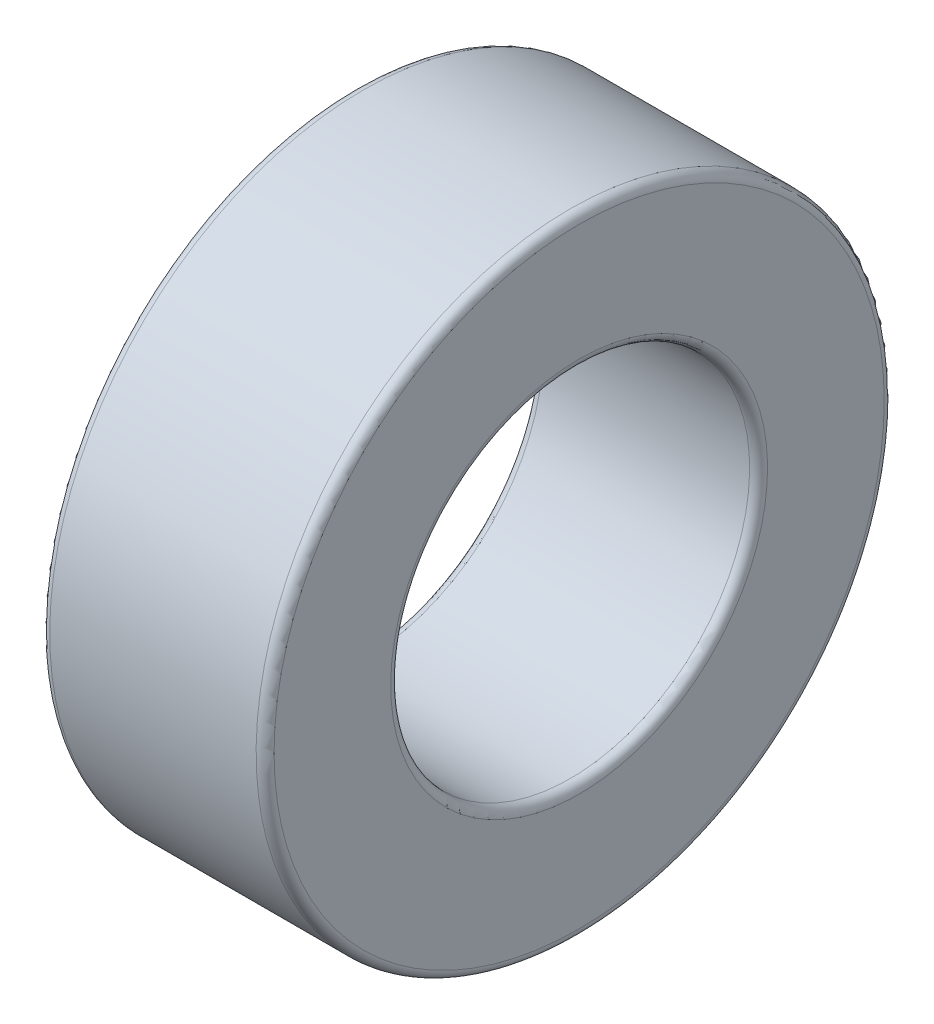
ISO-10303-21;
HEADER;
FILE_DESCRIPTION(('STEP AP214'),'2;1');
FILE_NAME('part.step','',(''),(''),'','','');
FILE_SCHEMA(('AUTOMOTIVE_DESIGN { 1 0 10303 214 1 1 1 1 }'));
ENDSEC;
DATA;
#1=APPLICATION_CONTEXT('core data for automotive mechanical design processes');
#2=APPLICATION_PROTOCOL_DEFINITION('international standard','automotive_design',2000,#1);
#3=PRODUCT_CONTEXT('',#1,'mechanical');
#4=PRODUCT('Part','Part','',(#3));
#5=PRODUCT_RELATED_PRODUCT_CATEGORY('part','',(#4));
#6=PRODUCT_DEFINITION_FORMATION('','',#4);
#7=PRODUCT_DEFINITION_CONTEXT('part definition',#1,'design');
#8=PRODUCT_DEFINITION('design','',#6,#7);
#9=PRODUCT_DEFINITION_SHAPE('','',#8);
#10=(LENGTH_UNIT() NAMED_UNIT(*) SI_UNIT(.MILLI.,.METRE.));
#11=(NAMED_UNIT(*) PLANE_ANGLE_UNIT() SI_UNIT($,.RADIAN.));
#12=(NAMED_UNIT(*) SI_UNIT($,.STERADIAN.) SOLID_ANGLE_UNIT());
#13=UNCERTAINTY_MEASURE_WITH_UNIT(LENGTH_MEASURE(1.E-05),#10,'distance_accuracy_value','');
#14=(GEOMETRIC_REPRESENTATION_CONTEXT(3) GLOBAL_UNCERTAINTY_ASSIGNED_CONTEXT((#13)) GLOBAL_UNIT_ASSIGNED_CONTEXT((#10,
#11,#12)) REPRESENTATION_CONTEXT('',''));
#15=CARTESIAN_POINT('',(0.,0.,0.));
#16=DIRECTION('',(0.,0.,1.));
#17=DIRECTION('',(1.,0.,0.));
#18=AXIS2_PLACEMENT_3D('',#15,#16,#17);
#19=CARTESIAN_POINT('',(0.,2.75,0.));
#20=DIRECTION('',(-1.,0.,0.));
#21=DIRECTION('',(0.,-1.,0.));
#22=AXIS2_PLACEMENT_3D('',#19,#20,#21);
#23=PLANE('',#22);
#24=CARTESIAN_POINT('',(0.,0.,0.));
#25=DIRECTION('',(1.,0.,0.));
#26=DIRECTION('',(0.,1.,0.));
#27=AXIS2_PLACEMENT_3D('',#24,#25,#26);
#28=CIRCLE('',#27,3.4);
#29=CARTESIAN_POINT('',(0.,3.4,0.));
#30=VERTEX_POINT('',#29);
#31=EDGE_CURVE('E28',#30,#30,#28,.T.);
#32=ORIENTED_EDGE('',*,*,#31,.F.);
#33=EDGE_LOOP('',(#32));
#34=FACE_BOUND('',#33,.T.);
#35=CARTESIAN_POINT('',(0.,0.,0.));
#36=DIRECTION('',(1.,0.,0.));
#37=DIRECTION('',(0.,1.,0.));
#38=AXIS2_PLACEMENT_3D('',#35,#36,#37);
#39=CIRCLE('',#38,2.1);
#40=CARTESIAN_POINT('',(0.,2.1,0.));
#41=VERTEX_POINT('',#40);
#42=EDGE_CURVE('E11',#41,#41,#39,.T.);
#43=ORIENTED_EDGE('',*,*,#42,.T.);
#44=EDGE_LOOP('',(#43));
#45=FACE_BOUND('',#44,.T.);
#46=ADVANCED_FACE('F18',(#34,#45),#23,.T.);
#47=CARTESIAN_POINT('',(0.1,0.,0.));
#48=DIRECTION('',(1.,0.,0.));
#49=DIRECTION('',(0.,0.,-1.));
#50=AXIS2_PLACEMENT_3D('',#47,#48,#49);
#51=TOROIDAL_SURFACE('',#50,3.4,0.1);
#52=CARTESIAN_POINT('',(0.1,0.,0.));
#53=DIRECTION('',(1.,0.,0.));
#54=DIRECTION('',(0.,1.,0.));
#55=AXIS2_PLACEMENT_3D('',#52,#53,#54);
#56=CIRCLE('',#55,3.5);
#57=CARTESIAN_POINT('',(0.1,3.5,0.));
#58=VERTEX_POINT('',#57);
#59=EDGE_CURVE('E127',#58,#58,#56,.T.);
#60=ORIENTED_EDGE('',*,*,#59,.F.);
#61=EDGE_LOOP('',(#60));
#62=FACE_BOUND('',#61,.T.);
#63=ORIENTED_EDGE('',*,*,#31,.T.);
#64=EDGE_LOOP('',(#63));
#65=FACE_BOUND('',#64,.T.);
#66=ADVANCED_FACE('F159',(#62,#65),#51,.T.);
#67=CARTESIAN_POINT('',(1.25,0.,0.));
#68=DIRECTION('',(-1.,0.,0.));
#69=DIRECTION('',(0.,1.,0.));
#70=AXIS2_PLACEMENT_3D('',#67,#68,#69);
#71=CYLINDRICAL_SURFACE('',#70,3.5);
#72=CARTESIAN_POINT('',(2.4,0.,0.));
#73=DIRECTION('',(1.,0.,0.));
#74=DIRECTION('',(0.,1.,0.));
#75=AXIS2_PLACEMENT_3D('',#72,#73,#74);
#76=CIRCLE('',#75,3.5);
#77=CARTESIAN_POINT('',(2.4,3.5,0.));
#78=VERTEX_POINT('',#77);
#79=EDGE_CURVE('E22',#78,#78,#76,.T.);
#80=ORIENTED_EDGE('',*,*,#79,.F.);
#81=EDGE_LOOP('',(#80));
#82=FACE_BOUND('',#81,.T.);
#83=ORIENTED_EDGE('',*,*,#59,.T.);
#84=EDGE_LOOP('',(#83));
#85=FACE_BOUND('',#84,.T.);
#86=ADVANCED_FACE('F164',(#82,#85),#71,.T.);
#87=CARTESIAN_POINT('',(2.4,0.,0.));
#88=DIRECTION('',(1.,0.,0.));
#89=DIRECTION('',(0.,0.,-1.));
#90=AXIS2_PLACEMENT_3D('',#87,#88,#89);
#91=TOROIDAL_SURFACE('',#90,3.4,0.1);
#92=CARTESIAN_POINT('',(2.5,0.,0.));
#93=DIRECTION('',(1.,0.,0.));
#94=DIRECTION('',(0.,1.,0.));
#95=AXIS2_PLACEMENT_3D('',#92,#93,#94);
#96=CIRCLE('',#95,3.4);
#97=CARTESIAN_POINT('',(2.5,3.4,0.));
#98=VERTEX_POINT('',#97);
#99=EDGE_CURVE('E110',#98,#98,#96,.T.);
#100=ORIENTED_EDGE('',*,*,#99,.F.);
#101=EDGE_LOOP('',(#100));
#102=FACE_BOUND('',#101,.T.);
#103=ORIENTED_EDGE('',*,*,#79,.T.);
#104=EDGE_LOOP('',(#103));
#105=FACE_BOUND('',#104,.T.);
#106=ADVANCED_FACE('F190',(#102,#105),#91,.T.);
#107=CARTESIAN_POINT('',(2.5,2.75,0.));
#108=DIRECTION('',(1.,0.,0.));
#109=DIRECTION('',(0.,1.,0.));
#110=AXIS2_PLACEMENT_3D('',#107,#108,#109);
#111=PLANE('',#110);
#112=CARTESIAN_POINT('',(2.5,0.,0.));
#113=DIRECTION('',(1.,0.,0.));
#114=DIRECTION('',(0.,1.,0.));
#115=AXIS2_PLACEMENT_3D('',#112,#113,#114);
#116=CIRCLE('',#115,2.1);
#117=CARTESIAN_POINT('',(2.5,2.1,0.));
#118=VERTEX_POINT('',#117);
#119=EDGE_CURVE('E76',#118,#118,#116,.T.);
#120=ORIENTED_EDGE('',*,*,#119,.F.);
#121=EDGE_LOOP('',(#120));
#122=FACE_BOUND('',#121,.T.);
#123=ORIENTED_EDGE('',*,*,#99,.T.);
#124=EDGE_LOOP('',(#123));
#125=FACE_BOUND('',#124,.T.);
#126=ADVANCED_FACE('F155',(#122,#125),#111,.T.);
#127=CARTESIAN_POINT('',(2.4,0.,0.));
#128=DIRECTION('',(1.,0.,0.));
#129=DIRECTION('',(0.,0.,-1.));
#130=AXIS2_PLACEMENT_3D('',#127,#128,#129);
#131=TOROIDAL_SURFACE('',#130,2.1,0.1);
#132=CARTESIAN_POINT('',(2.4,0.,0.));
#133=DIRECTION('',(1.,0.,0.));
#134=DIRECTION('',(0.,1.,0.));
#135=AXIS2_PLACEMENT_3D('',#132,#133,#134);
#136=CIRCLE('',#135,2.);
#137=CARTESIAN_POINT('',(2.4,2.,0.));
#138=VERTEX_POINT('',#137);
#139=EDGE_CURVE('E82',#138,#138,#136,.T.);
#140=ORIENTED_EDGE('',*,*,#139,.F.);
#141=EDGE_LOOP('',(#140));
#142=FACE_BOUND('',#141,.T.);
#143=ORIENTED_EDGE('',*,*,#119,.T.);
#144=EDGE_LOOP('',(#143));
#145=FACE_BOUND('',#144,.T.);
#146=ADVANCED_FACE('F145',(#142,#145),#131,.T.);
#147=CARTESIAN_POINT('',(1.25,0.,0.));
#148=DIRECTION('',(-1.,0.,0.));
#149=DIRECTION('',(0.,1.,0.));
#150=AXIS2_PLACEMENT_3D('',#147,#148,#149);
#151=CYLINDRICAL_SURFACE('',#150,2.);
#152=CARTESIAN_POINT('',(0.1,0.,0.));
#153=DIRECTION('',(1.,0.,0.));
#154=DIRECTION('',(0.,1.,0.));
#155=AXIS2_PLACEMENT_3D('',#152,#153,#154);
#156=CIRCLE('',#155,2.);
#157=CARTESIAN_POINT('',(0.1,2.,0.));
#158=VERTEX_POINT('',#157);
#159=EDGE_CURVE('E98',#158,#158,#156,.T.);
#160=ORIENTED_EDGE('',*,*,#159,.F.);
#161=EDGE_LOOP('',(#160));
#162=FACE_BOUND('',#161,.T.);
#163=ORIENTED_EDGE('',*,*,#139,.T.);
#164=EDGE_LOOP('',(#163));
#165=FACE_BOUND('',#164,.T.);
#166=ADVANCED_FACE('F142',(#162,#165),#151,.F.);
#167=CARTESIAN_POINT('',(0.1,0.,0.));
#168=DIRECTION('',(1.,0.,0.));
#169=DIRECTION('',(0.,0.,-1.));
#170=AXIS2_PLACEMENT_3D('',#167,#168,#169);
#171=TOROIDAL_SURFACE('',#170,2.1,0.1);
#172=ORIENTED_EDGE('',*,*,#42,.F.);
#173=EDGE_LOOP('',(#172));
#174=FACE_BOUND('',#173,.T.);
#175=ORIENTED_EDGE('',*,*,#159,.T.);
#176=EDGE_LOOP('',(#175));
#177=FACE_BOUND('',#176,.T.);
#178=ADVANCED_FACE('F144',(#174,#177),#171,.T.);
#179=CLOSED_SHELL('',(#46,#66,#86,#106,#126,#146,#166,#178));
#180=CARTESIAN_POINT('',(1.295,-2.75,0.));
#181=DIRECTION('',(1.,0.,0.));
#182=DIRECTION('',(0.,-1.,0.));
#183=AXIS2_PLACEMENT_3D('',#180,#181,#182);
#184=PLANE('',#183);
#185=CARTESIAN_POINT('',(1.295,0.,0.));
#186=DIRECTION('',(1.,0.,0.));
#187=DIRECTION('',(0.,-1.,0.));
#188=AXIS2_PLACEMENT_3D('',#185,#186,#187);
#189=CIRCLE('',#188,2.705);
#190=CARTESIAN_POINT('',(1.295,2.705,0.));
#191=VERTEX_POINT('',#190);
#192=EDGE_CURVE('E118',#191,#191,#189,.T.);
#193=ORIENTED_EDGE('',*,*,#192,.F.);
#194=EDGE_LOOP('',(#193));
#195=FACE_BOUND('',#194,.T.);
#196=CARTESIAN_POINT('',(1.295,0.,0.));
#197=DIRECTION('',(1.,0.,0.));
#198=DIRECTION('',(0.,-1.,0.));
#199=AXIS2_PLACEMENT_3D('',#196,#197,#198);
#200=CIRCLE('',#199,2.5);
#201=CARTESIAN_POINT('',(1.295,-2.5,0.));
#202=VERTEX_POINT('',#201);
#203=EDGE_CURVE('E95',#202,#202,#200,.T.);
#204=ORIENTED_EDGE('',*,*,#203,.T.);
#205=EDGE_LOOP('',(#204));
#206=FACE_BOUND('',#205,.T.);
#207=ADVANCED_FACE('F194',(#195,#206),#184,.F.);
#208=CARTESIAN_POINT('',(1.205,-2.75,0.));
#209=DIRECTION('',(-1.,0.,0.));
#210=DIRECTION('',(0.,1.,0.));
#211=AXIS2_PLACEMENT_3D('',#208,#209,#210);
#212=PLANE('',#211);
#213=CARTESIAN_POINT('',(1.205,0.,0.));
#214=DIRECTION('',(-1.,0.,0.));
#215=DIRECTION('',(0.,-1.,0.));
#216=AXIS2_PLACEMENT_3D('',#213,#214,#215);
#217=CIRCLE('',#216,2.705);
#218=CARTESIAN_POINT('',(1.205,2.705,0.));
#219=VERTEX_POINT('',#218);
#220=EDGE_CURVE('E122',#219,#219,#217,.T.);
#221=ORIENTED_EDGE('',*,*,#220,.F.);
#222=EDGE_LOOP('',(#221));
#223=FACE_BOUND('',#222,.T.);
#224=CARTESIAN_POINT('',(1.205,0.,0.));
#225=DIRECTION('',(1.,0.,0.));
#226=DIRECTION('',(0.,-1.,0.));
#227=AXIS2_PLACEMENT_3D('',#224,#225,#226);
#228=CIRCLE('',#227,2.5);
#229=CARTESIAN_POINT('',(1.205,-2.5,0.));
#230=VERTEX_POINT('',#229);
#231=EDGE_CURVE('E104',#230,#230,#228,.T.);
#232=ORIENTED_EDGE('',*,*,#231,.F.);
#233=EDGE_LOOP('',(#232));
#234=FACE_BOUND('',#233,.T.);
#235=ADVANCED_FACE('F175',(#223,#234),#212,.F.);
#236=CARTESIAN_POINT('',(1.25,0.,0.));
#237=DIRECTION('',(-1.,0.,0.));
#238=DIRECTION('',(0.,-1.,0.));
#239=AXIS2_PLACEMENT_3D('',#236,#237,#238);
#240=CYLINDRICAL_SURFACE('',#239,3.);
#241=CARTESIAN_POINT('',(1.295,0.,0.));
#242=DIRECTION('',(1.,0.,0.));
#243=DIRECTION('',(0.,-1.,0.));
#244=AXIS2_PLACEMENT_3D('',#241,#242,#243);
#245=CIRCLE('',#244,3.);
#246=CARTESIAN_POINT('',(1.295,-3.,0.));
#247=VERTEX_POINT('',#246);
#248=EDGE_CURVE('E99',#247,#247,#245,.T.);
#249=ORIENTED_EDGE('',*,*,#248,.T.);
#250=EDGE_LOOP('',(#249));
#251=FACE_BOUND('',#250,.T.);
#252=CARTESIAN_POINT('',(1.205,0.,0.));
#253=DIRECTION('',(1.,0.,0.));
#254=DIRECTION('',(0.,-1.,0.));
#255=AXIS2_PLACEMENT_3D('',#252,#253,#254);
#256=CIRCLE('',#255,3.);
#257=CARTESIAN_POINT('',(1.205,-3.,0.));
#258=VERTEX_POINT('',#257);
#259=EDGE_CURVE('E112',#258,#258,#256,.T.);
#260=ORIENTED_EDGE('',*,*,#259,.F.);
#261=EDGE_LOOP('',(#260));
#262=FACE_BOUND('',#261,.T.);
#263=ADVANCED_FACE('F172',(#251,#262),#240,.F.);
#264=CARTESIAN_POINT('',(1.295,-2.75,0.));
#265=DIRECTION('',(1.,0.,0.));
#266=DIRECTION('',(0.,-1.,0.));
#267=AXIS2_PLACEMENT_3D('',#264,#265,#266);
#268=PLANE('',#267);
#269=CARTESIAN_POINT('',(1.295,0.,0.));
#270=DIRECTION('',(-1.,0.,0.));
#271=DIRECTION('',(0.,-1.,0.));
#272=AXIS2_PLACEMENT_3D('',#269,#270,#271);
#273=CIRCLE('',#272,2.795);
#274=CARTESIAN_POINT('',(1.295,2.795,0.));
#275=VERTEX_POINT('',#274);
#276=EDGE_CURVE('E123',#275,#275,#273,.T.);
#277=ORIENTED_EDGE('',*,*,#276,.F.);
#278=EDGE_LOOP('',(#277));
#279=FACE_BOUND('',#278,.T.);
#280=ORIENTED_EDGE('',*,*,#248,.F.);
#281=EDGE_LOOP('',(#280));
#282=FACE_BOUND('',#281,.T.);
#283=ADVANCED_FACE('F174',(#279,#282),#268,.F.);
#284=CARTESIAN_POINT('',(1.25,0.,0.));
#285=DIRECTION('',(-1.,0.,0.));
#286=DIRECTION('',(0.,-1.,0.));
#287=AXIS2_PLACEMENT_3D('',#284,#285,#286);
#288=CYLINDRICAL_SURFACE('',#287,2.5);
#289=ORIENTED_EDGE('',*,*,#231,.T.);
#290=EDGE_LOOP('',(#289));
#291=FACE_BOUND('',#290,.T.);
#292=ORIENTED_EDGE('',*,*,#203,.F.);
#293=EDGE_LOOP('',(#292));
#294=FACE_BOUND('',#293,.T.);
#295=ADVANCED_FACE('F96',(#291,#294),#288,.T.);
#296=CARTESIAN_POINT('',(1.205,-2.75,0.));
#297=DIRECTION('',(-1.,0.,0.));
#298=DIRECTION('',(0.,1.,0.));
#299=AXIS2_PLACEMENT_3D('',#296,#297,#298);
#300=PLANE('',#299);
#301=CARTESIAN_POINT('',(1.205,0.,0.));
#302=DIRECTION('',(1.,0.,0.));
#303=DIRECTION('',(0.,-1.,0.));
#304=AXIS2_PLACEMENT_3D('',#301,#302,#303);
#305=CIRCLE('',#304,2.795);
#306=CARTESIAN_POINT('',(1.205,2.795,0.));
#307=VERTEX_POINT('',#306);
#308=EDGE_CURVE('E108',#307,#307,#305,.T.);
#309=ORIENTED_EDGE('',*,*,#308,.F.);
#310=EDGE_LOOP('',(#309));
#311=FACE_BOUND('',#310,.T.);
#312=ORIENTED_EDGE('',*,*,#259,.T.);
#313=EDGE_LOOP('',(#312));
#314=FACE_BOUND('',#313,.T.);
#315=ADVANCED_FACE('F197',(#311,#314),#300,.F.);
#316=CARTESIAN_POINT('',(1.25,0.,0.));
#317=DIRECTION('',(-1.,0.,0.));
#318=DIRECTION('',(0.,-1.,0.));
#319=AXIS2_PLACEMENT_3D('',#316,#317,#318);
#320=CYLINDRICAL_SURFACE('',#319,2.795);
#321=ORIENTED_EDGE('',*,*,#308,.T.);
#322=EDGE_LOOP('',(#321));
#323=FACE_BOUND('',#322,.T.);
#324=CARTESIAN_POINT('',(0.46875,0.,0.));
#325=DIRECTION('',(1.,0.,0.));
#326=DIRECTION('',(0.,-1.,0.));
#327=AXIS2_PLACEMENT_3D('',#324,#325,#326);
#328=CIRCLE('',#327,2.795);
#329=CARTESIAN_POINT('',(0.46875,-2.795,0.));
#330=VERTEX_POINT('',#329);
#331=EDGE_CURVE('E115',#330,#330,#328,.T.);
#332=ORIENTED_EDGE('',*,*,#331,.F.);
#333=EDGE_LOOP('',(#332));
#334=FACE_BOUND('',#333,.T.);
#335=ADVANCED_FACE('F20',(#323,#334),#320,.F.);
#336=CARTESIAN_POINT('',(1.25,0.,0.));
#337=DIRECTION('',(-1.,0.,0.));
#338=DIRECTION('',(0.,-1.,0.));
#339=AXIS2_PLACEMENT_3D('',#336,#337,#338);
#340=CYLINDRICAL_SURFACE('',#339,2.705);
#341=ORIENTED_EDGE('',*,*,#220,.T.);
#342=EDGE_LOOP('',(#341));
#343=FACE_BOUND('',#342,.T.);
#344=CARTESIAN_POINT('',(0.46875,0.,0.));
#345=DIRECTION('',(1.,0.,0.));
#346=DIRECTION('',(0.,-1.,0.));
#347=AXIS2_PLACEMENT_3D('',#344,#345,#346);
#348=CIRCLE('',#347,2.705);
#349=CARTESIAN_POINT('',(0.46875,-2.705,0.));
#350=VERTEX_POINT('',#349);
#351=EDGE_CURVE('E119',#350,#350,#348,.T.);
#352=ORIENTED_EDGE('',*,*,#351,.T.);
#353=EDGE_LOOP('',(#352));
#354=FACE_BOUND('',#353,.T.);
#355=ADVANCED_FACE('F186',(#343,#354),#340,.T.);
#356=CARTESIAN_POINT('',(1.25,0.,0.));
#357=DIRECTION('',(-1.,0.,0.));
#358=DIRECTION('',(0.,-1.,0.));
#359=AXIS2_PLACEMENT_3D('',#356,#357,#358);
#360=CYLINDRICAL_SURFACE('',#359,2.795);
#361=ORIENTED_EDGE('',*,*,#276,.T.);
#362=EDGE_LOOP('',(#361));
#363=FACE_BOUND('',#362,.T.);
#364=CARTESIAN_POINT('',(2.03125,0.,0.));
#365=DIRECTION('',(1.,0.,0.));
#366=DIRECTION('',(0.,-1.,0.));
#367=AXIS2_PLACEMENT_3D('',#364,#365,#366);
#368=CIRCLE('',#367,2.795);
#369=CARTESIAN_POINT('',(2.03125,-2.795,0.));
#370=VERTEX_POINT('',#369);
#371=EDGE_CURVE('E130',#370,#370,#368,.T.);
#372=ORIENTED_EDGE('',*,*,#371,.T.);
#373=EDGE_LOOP('',(#372));
#374=FACE_BOUND('',#373,.T.);
#375=ADVANCED_FACE('F182',(#363,#374),#360,.F.);
#376=CARTESIAN_POINT('',(2.03125,-2.75,0.));
#377=DIRECTION('',(1.,0.,0.));
#378=DIRECTION('',(0.,-1.,0.));
#379=AXIS2_PLACEMENT_3D('',#376,#377,#378);
#380=PLANE('',#379);
#381=CARTESIAN_POINT('',(2.03125,0.,0.));
#382=DIRECTION('',(1.,0.,0.));
#383=DIRECTION('',(0.,-1.,0.));
#384=AXIS2_PLACEMENT_3D('',#381,#382,#383);
#385=CIRCLE('',#384,2.705);
#386=CARTESIAN_POINT('',(2.03125,-2.705,0.));
#387=VERTEX_POINT('',#386);
#388=EDGE_CURVE('E125',#387,#387,#385,.T.);
#389=ORIENTED_EDGE('',*,*,#388,.T.);
#390=EDGE_LOOP('',(#389));
#391=FACE_BOUND('',#390,.T.);
#392=ORIENTED_EDGE('',*,*,#371,.F.);
#393=EDGE_LOOP('',(#392));
#394=FACE_BOUND('',#393,.T.);
#395=ADVANCED_FACE('F185',(#391,#394),#380,.F.);
#396=CARTESIAN_POINT('',(1.25,0.,0.));
#397=DIRECTION('',(-1.,0.,0.));
#398=DIRECTION('',(0.,-1.,0.));
#399=AXIS2_PLACEMENT_3D('',#396,#397,#398);
#400=CYLINDRICAL_SURFACE('',#399,2.705);
#401=ORIENTED_EDGE('',*,*,#192,.T.);
#402=EDGE_LOOP('',(#401));
#403=FACE_BOUND('',#402,.T.);
#404=ORIENTED_EDGE('',*,*,#388,.F.);
#405=EDGE_LOOP('',(#404));
#406=FACE_BOUND('',#405,.T.);
#407=ADVANCED_FACE('F170',(#403,#406),#400,.T.);
#408=CARTESIAN_POINT('',(0.46875,-2.75,0.));
#409=DIRECTION('',(-1.,0.,0.));
#410=DIRECTION('',(0.,1.,0.));
#411=AXIS2_PLACEMENT_3D('',#408,#409,#410);
#412=PLANE('',#411);
#413=ORIENTED_EDGE('',*,*,#331,.T.);
#414=EDGE_LOOP('',(#413));
#415=FACE_BOUND('',#414,.T.);
#416=ORIENTED_EDGE('',*,*,#351,.F.);
#417=EDGE_LOOP('',(#416));
#418=FACE_BOUND('',#417,.T.);
#419=ADVANCED_FACE('F312',(#415,#418),#412,.F.);
#420=CLOSED_SHELL('',(#207,#235,#263,#283,#295,#315,#335,#355,#375,#395,#407,#419));
#421=ORIENTED_CLOSED_SHELL('',*,#179,.T.);
#422=BREP_WITH_VOIDS('B1',#420,(#421));
#423=ADVANCED_BREP_SHAPE_REPRESENTATION('',(#18,#422),#14);
#424=SHAPE_DEFINITION_REPRESENTATION(#9,#423);
ENDSEC;
END-ISO-10303-21;
